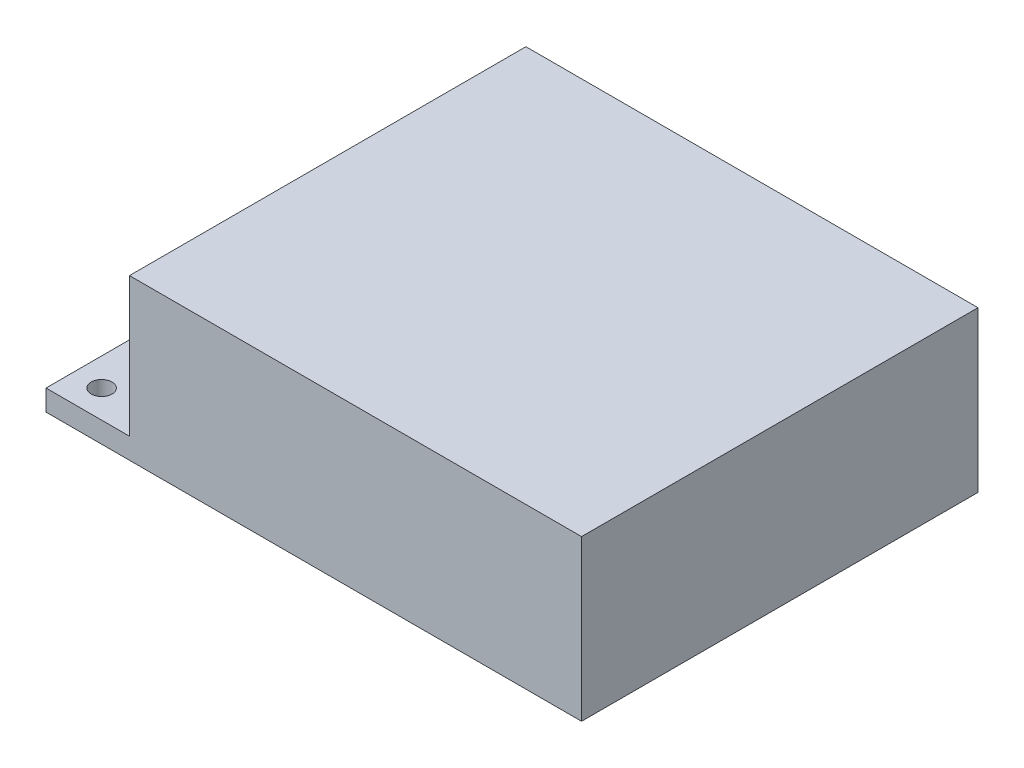
ISO-10303-21;
HEADER;
FILE_DESCRIPTION(('STEP AP214'),'2;1');
FILE_NAME('part.step','',(''),(''),'','','');
FILE_SCHEMA(('AUTOMOTIVE_DESIGN { 1 0 10303 214 1 1 1 1 }'));
ENDSEC;
DATA;
#1=APPLICATION_CONTEXT('core data for automotive mechanical design processes');
#2=APPLICATION_PROTOCOL_DEFINITION('international standard','automotive_design',2000,#1);
#3=PRODUCT_CONTEXT('',#1,'mechanical');
#4=PRODUCT('Part','Part','',(#3));
#5=PRODUCT_RELATED_PRODUCT_CATEGORY('part','',(#4));
#6=PRODUCT_DEFINITION_FORMATION('','',#4);
#7=PRODUCT_DEFINITION_CONTEXT('part definition',#1,'design');
#8=PRODUCT_DEFINITION('design','',#6,#7);
#9=PRODUCT_DEFINITION_SHAPE('','',#8);
#10=(LENGTH_UNIT() NAMED_UNIT(*) SI_UNIT(.MILLI.,.METRE.));
#11=(NAMED_UNIT(*) PLANE_ANGLE_UNIT() SI_UNIT($,.RADIAN.));
#12=(NAMED_UNIT(*) SI_UNIT($,.STERADIAN.) SOLID_ANGLE_UNIT());
#13=UNCERTAINTY_MEASURE_WITH_UNIT(LENGTH_MEASURE(1.E-05),#10,'distance_accuracy_value','');
#14=(GEOMETRIC_REPRESENTATION_CONTEXT(3) GLOBAL_UNCERTAINTY_ASSIGNED_CONTEXT((#13)) GLOBAL_UNIT_ASSIGNED_CONTEXT((#10,
#11,#12)) REPRESENTATION_CONTEXT('',''));
#15=CARTESIAN_POINT('',(0.,0.,0.));
#16=DIRECTION('',(0.,0.,1.));
#17=DIRECTION('',(1.,0.,0.));
#18=AXIS2_PLACEMENT_3D('',#15,#16,#17);
#19=CARTESIAN_POINT('',(0.,3.,0.));
#20=DIRECTION('',(0.,-1.,0.));
#21=DIRECTION('',(0.,0.,-1.));
#22=AXIS2_PLACEMENT_3D('',#19,#20,#21);
#23=PLANE('',#22);
#24=CARTESIAN_POINT('',(-34.5,3.,24.5));
#25=DIRECTION('',(0.,1.,0.));
#26=DIRECTION('',(0.,0.,1.));
#27=AXIS2_PLACEMENT_3D('',#24,#25,#26);
#28=CIRCLE('',#27,1.5);
#29=CARTESIAN_POINT('',(-34.5,3.,26.));
#30=VERTEX_POINT('',#29);
#31=EDGE_CURVE('E149',#30,#30,#28,.T.);
#32=ORIENTED_EDGE('',*,*,#31,.F.);
#33=EDGE_LOOP('',(#32));
#34=FACE_BOUND('',#33,.T.);
#35=CARTESIAN_POINT('',(-34.5,3.,-24.5));
#36=DIRECTION('',(0.,1.,0.));
#37=DIRECTION('',(0.,0.,1.));
#38=AXIS2_PLACEMENT_3D('',#35,#36,#37);
#39=CIRCLE('',#38,1.5);
#40=CARTESIAN_POINT('',(-34.5,3.,-23.));
#41=VERTEX_POINT('',#40);
#42=EDGE_CURVE('E100',#41,#41,#39,.T.);
#43=ORIENTED_EDGE('',*,*,#42,.F.);
#44=EDGE_LOOP('',(#43));
#45=FACE_BOUND('',#44,.T.);
#46=DIRECTION('',(0.,0.,1.));
#47=VECTOR('',#46,1.);
#48=CARTESIAN_POINT('',(-26.5,3.,-28.5));
#49=LINE('',#48,#47);
#50=CARTESIAN_POINT('',(-26.5,3.,-28.5));
#51=VERTEX_POINT('',#50);
#52=CARTESIAN_POINT('',(-26.5,3.,28.5));
#53=VERTEX_POINT('',#52);
#54=EDGE_CURVE('E48',#51,#53,#49,.T.);
#55=ORIENTED_EDGE('',*,*,#54,.F.);
#56=DIRECTION('',(-1.,0.,0.));
#57=VECTOR('',#56,1.);
#58=CARTESIAN_POINT('',(-38.5,3.,-28.5));
#59=LINE('',#58,#57);
#60=CARTESIAN_POINT('',(-38.5,3.,-28.5));
#61=VERTEX_POINT('',#60);
#62=EDGE_CURVE('E85',#51,#61,#59,.T.);
#63=ORIENTED_EDGE('',*,*,#62,.T.);
#64=DIRECTION('',(0.,0.,1.));
#65=VECTOR('',#64,1.);
#66=CARTESIAN_POINT('',(-38.5,3.,28.5));
#67=LINE('',#66,#65);
#68=CARTESIAN_POINT('',(-38.5,3.,28.5));
#69=VERTEX_POINT('',#68);
#70=EDGE_CURVE('E54',#61,#69,#67,.T.);
#71=ORIENTED_EDGE('',*,*,#70,.T.);
#72=DIRECTION('',(1.,0.,0.));
#73=VECTOR('',#72,1.);
#74=CARTESIAN_POINT('',(-38.5,3.,28.5));
#75=LINE('',#74,#73);
#76=EDGE_CURVE('E95',#69,#53,#75,.T.);
#77=ORIENTED_EDGE('',*,*,#76,.T.);
#78=EDGE_LOOP('',(#55,#63,#71,#77));
#79=FACE_BOUND('',#78,.T.);
#80=ADVANCED_FACE('F33',(#34,#45,#79),#23,.F.);
#81=CARTESIAN_POINT('',(0.,0.,0.));
#82=DIRECTION('',(0.,-1.,0.));
#83=DIRECTION('',(0.,0.,-1.));
#84=AXIS2_PLACEMENT_3D('',#81,#82,#83);
#85=PLANE('',#84);
#86=CARTESIAN_POINT('',(-34.5,0.,-24.5));
#87=DIRECTION('',(0.,1.,0.));
#88=DIRECTION('',(0.,0.,1.));
#89=AXIS2_PLACEMENT_3D('',#86,#87,#88);
#90=CIRCLE('',#89,1.5);
#91=CARTESIAN_POINT('',(-34.5,0.,-23.));
#92=VERTEX_POINT('',#91);
#93=EDGE_CURVE('E104',#92,#92,#90,.T.);
#94=ORIENTED_EDGE('',*,*,#93,.T.);
#95=EDGE_LOOP('',(#94));
#96=FACE_BOUND('',#95,.T.);
#97=DIRECTION('',(0.,0.,-1.));
#98=VECTOR('',#97,1.);
#99=CARTESIAN_POINT('',(38.5,0.,28.5));
#100=LINE('',#99,#98);
#101=CARTESIAN_POINT('',(38.5,0.,28.5));
#102=VERTEX_POINT('',#101);
#103=CARTESIAN_POINT('',(38.5,0.,-28.5));
#104=VERTEX_POINT('',#103);
#105=EDGE_CURVE('E92',#102,#104,#100,.T.);
#106=ORIENTED_EDGE('',*,*,#105,.F.);
#107=DIRECTION('',(1.,0.,0.));
#108=VECTOR('',#107,1.);
#109=CARTESIAN_POINT('',(-38.5,0.,28.5));
#110=LINE('',#109,#108);
#111=CARTESIAN_POINT('',(-38.5,0.,28.5));
#112=VERTEX_POINT('',#111);
#113=EDGE_CURVE('E74',#112,#102,#110,.T.);
#114=ORIENTED_EDGE('',*,*,#113,.F.);
#115=DIRECTION('',(0.,0.,1.));
#116=VECTOR('',#115,1.);
#117=CARTESIAN_POINT('',(-38.5,0.,28.5));
#118=LINE('',#117,#116);
#119=CARTESIAN_POINT('',(-38.5,0.,-28.5));
#120=VERTEX_POINT('',#119);
#121=EDGE_CURVE('E86',#120,#112,#118,.T.);
#122=ORIENTED_EDGE('',*,*,#121,.F.);
#123=DIRECTION('',(-1.,0.,0.));
#124=VECTOR('',#123,1.);
#125=CARTESIAN_POINT('',(-38.5,0.,-28.5));
#126=LINE('',#125,#124);
#127=EDGE_CURVE('E99',#104,#120,#126,.T.);
#128=ORIENTED_EDGE('',*,*,#127,.F.);
#129=EDGE_LOOP('',(#106,#114,#122,#128));
#130=FACE_BOUND('',#129,.T.);
#131=CARTESIAN_POINT('',(-34.5,0.,24.5));
#132=DIRECTION('',(0.,1.,0.));
#133=DIRECTION('',(0.,0.,1.));
#134=AXIS2_PLACEMENT_3D('',#131,#132,#133);
#135=CIRCLE('',#134,1.5);
#136=CARTESIAN_POINT('',(-34.5,0.,26.));
#137=VERTEX_POINT('',#136);
#138=EDGE_CURVE('E148',#137,#137,#135,.T.);
#139=ORIENTED_EDGE('',*,*,#138,.T.);
#140=EDGE_LOOP('',(#139));
#141=FACE_BOUND('',#140,.T.);
#142=ADVANCED_FACE('F97',(#96,#130,#141),#85,.T.);
#143=CARTESIAN_POINT('',(38.5,3.,28.5));
#144=DIRECTION('',(-1.,0.,0.));
#145=DIRECTION('',(0.,0.,1.));
#146=AXIS2_PLACEMENT_3D('',#143,#144,#145);
#147=PLANE('',#146);
#148=ORIENTED_EDGE('',*,*,#105,.T.);
#149=DIRECTION('',(0.,-1.,0.));
#150=VECTOR('',#149,1.);
#151=CARTESIAN_POINT('',(38.5,3.,-28.5));
#152=LINE('',#151,#150);
#153=CARTESIAN_POINT('',(38.5,23.,-28.5));
#154=VERTEX_POINT('',#153);
#155=EDGE_CURVE('E11',#154,#104,#152,.T.);
#156=ORIENTED_EDGE('',*,*,#155,.F.);
#157=DIRECTION('',(0.,0.,-1.));
#158=VECTOR('',#157,1.);
#159=CARTESIAN_POINT('',(38.5,23.,-28.5));
#160=LINE('',#159,#158);
#161=CARTESIAN_POINT('',(38.5,23.,28.5));
#162=VERTEX_POINT('',#161);
#163=EDGE_CURVE('E94',#162,#154,#160,.T.);
#164=ORIENTED_EDGE('',*,*,#163,.F.);
#165=DIRECTION('',(0.,-1.,0.));
#166=VECTOR('',#165,1.);
#167=CARTESIAN_POINT('',(38.5,3.,28.5));
#168=LINE('',#167,#166);
#169=EDGE_CURVE('E78',#162,#102,#168,.T.);
#170=ORIENTED_EDGE('',*,*,#169,.T.);
#171=EDGE_LOOP('',(#148,#156,#164,#170));
#172=FACE_BOUND('',#171,.T.);
#173=ADVANCED_FACE('F35',(#172),#147,.F.);
#174=CARTESIAN_POINT('',(-38.5,3.,-28.5));
#175=DIRECTION('',(0.,0.,1.));
#176=DIRECTION('',(1.,0.,0.));
#177=AXIS2_PLACEMENT_3D('',#174,#175,#176);
#178=PLANE('',#177);
#179=ORIENTED_EDGE('',*,*,#127,.T.);
#180=DIRECTION('',(0.,-1.,0.));
#181=VECTOR('',#180,1.);
#182=CARTESIAN_POINT('',(-38.5,3.,-28.5));
#183=LINE('',#182,#181);
#184=EDGE_CURVE('E41',#61,#120,#183,.T.);
#185=ORIENTED_EDGE('',*,*,#184,.F.);
#186=ORIENTED_EDGE('',*,*,#62,.F.);
#187=DIRECTION('',(0.,-1.,0.));
#188=VECTOR('',#187,1.);
#189=CARTESIAN_POINT('',(-26.5,23.,-28.5));
#190=LINE('',#189,#188);
#191=CARTESIAN_POINT('',(-26.5,23.,-28.5));
#192=VERTEX_POINT('',#191);
#193=EDGE_CURVE('E141',#192,#51,#190,.T.);
#194=ORIENTED_EDGE('',*,*,#193,.F.);
#195=DIRECTION('',(-1.,0.,0.));
#196=VECTOR('',#195,1.);
#197=CARTESIAN_POINT('',(38.5,23.,-28.5));
#198=LINE('',#197,#196);
#199=EDGE_CURVE('E121',#154,#192,#198,.T.);
#200=ORIENTED_EDGE('',*,*,#199,.F.);
#201=ORIENTED_EDGE('',*,*,#155,.T.);
#202=EDGE_LOOP('',(#179,#185,#186,#194,#200,#201));
#203=FACE_BOUND('',#202,.T.);
#204=ADVANCED_FACE('F115',(#203),#178,.F.);
#205=CARTESIAN_POINT('',(-38.5,3.,28.5));
#206=DIRECTION('',(1.,0.,0.));
#207=DIRECTION('',(0.,0.,-1.));
#208=AXIS2_PLACEMENT_3D('',#205,#206,#207);
#209=PLANE('',#208);
#210=ORIENTED_EDGE('',*,*,#121,.T.);
#211=DIRECTION('',(0.,-1.,0.));
#212=VECTOR('',#211,1.);
#213=CARTESIAN_POINT('',(-38.5,3.,28.5));
#214=LINE('',#213,#212);
#215=EDGE_CURVE('E81',#69,#112,#214,.T.);
#216=ORIENTED_EDGE('',*,*,#215,.F.);
#217=ORIENTED_EDGE('',*,*,#70,.F.);
#218=ORIENTED_EDGE('',*,*,#184,.T.);
#219=EDGE_LOOP('',(#210,#216,#217,#218));
#220=FACE_BOUND('',#219,.T.);
#221=ADVANCED_FACE('F113',(#220),#209,.F.);
#222=CARTESIAN_POINT('',(-38.5,3.,28.5));
#223=DIRECTION('',(0.,0.,-1.));
#224=DIRECTION('',(-1.,0.,0.));
#225=AXIS2_PLACEMENT_3D('',#222,#223,#224);
#226=PLANE('',#225);
#227=ORIENTED_EDGE('',*,*,#113,.T.);
#228=ORIENTED_EDGE('',*,*,#169,.F.);
#229=DIRECTION('',(1.,0.,0.));
#230=VECTOR('',#229,1.);
#231=CARTESIAN_POINT('',(38.5,23.,28.5));
#232=LINE('',#231,#230);
#233=CARTESIAN_POINT('',(-26.5,23.,28.5));
#234=VERTEX_POINT('',#233);
#235=EDGE_CURVE('E135',#234,#162,#232,.T.);
#236=ORIENTED_EDGE('',*,*,#235,.F.);
#237=DIRECTION('',(0.,-1.,0.));
#238=VECTOR('',#237,1.);
#239=CARTESIAN_POINT('',(-26.5,23.,28.5));
#240=LINE('',#239,#238);
#241=EDGE_CURVE('E139',#234,#53,#240,.T.);
#242=ORIENTED_EDGE('',*,*,#241,.T.);
#243=ORIENTED_EDGE('',*,*,#76,.F.);
#244=ORIENTED_EDGE('',*,*,#215,.T.);
#245=EDGE_LOOP('',(#227,#228,#236,#242,#243,#244));
#246=FACE_BOUND('',#245,.T.);
#247=ADVANCED_FACE('F76',(#246),#226,.F.);
#248=CARTESIAN_POINT('',(-34.5,3.,-24.5));
#249=DIRECTION('',(0.,-1.,0.));
#250=DIRECTION('',(0.,0.,-1.));
#251=AXIS2_PLACEMENT_3D('',#248,#249,#250);
#252=CYLINDRICAL_SURFACE('',#251,1.5);
#253=ORIENTED_EDGE('',*,*,#42,.T.);
#254=EDGE_LOOP('',(#253));
#255=FACE_BOUND('',#254,.T.);
#256=ORIENTED_EDGE('',*,*,#93,.F.);
#257=EDGE_LOOP('',(#256));
#258=FACE_BOUND('',#257,.T.);
#259=ADVANCED_FACE('F167',(#255,#258),#252,.F.);
#260=CARTESIAN_POINT('',(-34.5,3.,24.5));
#261=DIRECTION('',(0.,-1.,0.));
#262=DIRECTION('',(0.,0.,-1.));
#263=AXIS2_PLACEMENT_3D('',#260,#261,#262);
#264=CYLINDRICAL_SURFACE('',#263,1.5);
#265=ORIENTED_EDGE('',*,*,#31,.T.);
#266=EDGE_LOOP('',(#265));
#267=FACE_BOUND('',#266,.T.);
#268=ORIENTED_EDGE('',*,*,#138,.F.);
#269=EDGE_LOOP('',(#268));
#270=FACE_BOUND('',#269,.T.);
#271=ADVANCED_FACE('F201',(#267,#270),#264,.F.);
#272=CARTESIAN_POINT('',(-26.5,23.,-28.5));
#273=DIRECTION('',(1.,0.,0.));
#274=DIRECTION('',(0.,0.,-1.));
#275=AXIS2_PLACEMENT_3D('',#272,#273,#274);
#276=PLANE('',#275);
#277=ORIENTED_EDGE('',*,*,#54,.T.);
#278=ORIENTED_EDGE('',*,*,#241,.F.);
#279=DIRECTION('',(0.,0.,1.));
#280=VECTOR('',#279,1.);
#281=CARTESIAN_POINT('',(-26.5,23.,-28.5));
#282=LINE('',#281,#280);
#283=EDGE_CURVE('E132',#192,#234,#282,.T.);
#284=ORIENTED_EDGE('',*,*,#283,.F.);
#285=ORIENTED_EDGE('',*,*,#193,.T.);
#286=EDGE_LOOP('',(#277,#278,#284,#285));
#287=FACE_BOUND('',#286,.T.);
#288=ADVANCED_FACE('F140',(#287),#276,.F.);
#289=CARTESIAN_POINT('',(0.,23.,0.));
#290=DIRECTION('',(0.,-1.,0.));
#291=DIRECTION('',(0.,0.,-1.));
#292=AXIS2_PLACEMENT_3D('',#289,#290,#291);
#293=PLANE('',#292);
#294=ORIENTED_EDGE('',*,*,#163,.T.);
#295=ORIENTED_EDGE('',*,*,#199,.T.);
#296=ORIENTED_EDGE('',*,*,#283,.T.);
#297=ORIENTED_EDGE('',*,*,#235,.T.);
#298=EDGE_LOOP('',(#294,#295,#296,#297));
#299=FACE_BOUND('',#298,.T.);
#300=ADVANCED_FACE('F134',(#299),#293,.F.);
#301=CLOSED_SHELL('',(#80,#142,#173,#204,#221,#247,#259,#271,#288,#300));
#302=MANIFOLD_SOLID_BREP('B2',#301);
#303=ADVANCED_BREP_SHAPE_REPRESENTATION('',(#18,#302),#14);
#304=SHAPE_DEFINITION_REPRESENTATION(#9,#303);
ENDSEC;
END-ISO-10303-21;
